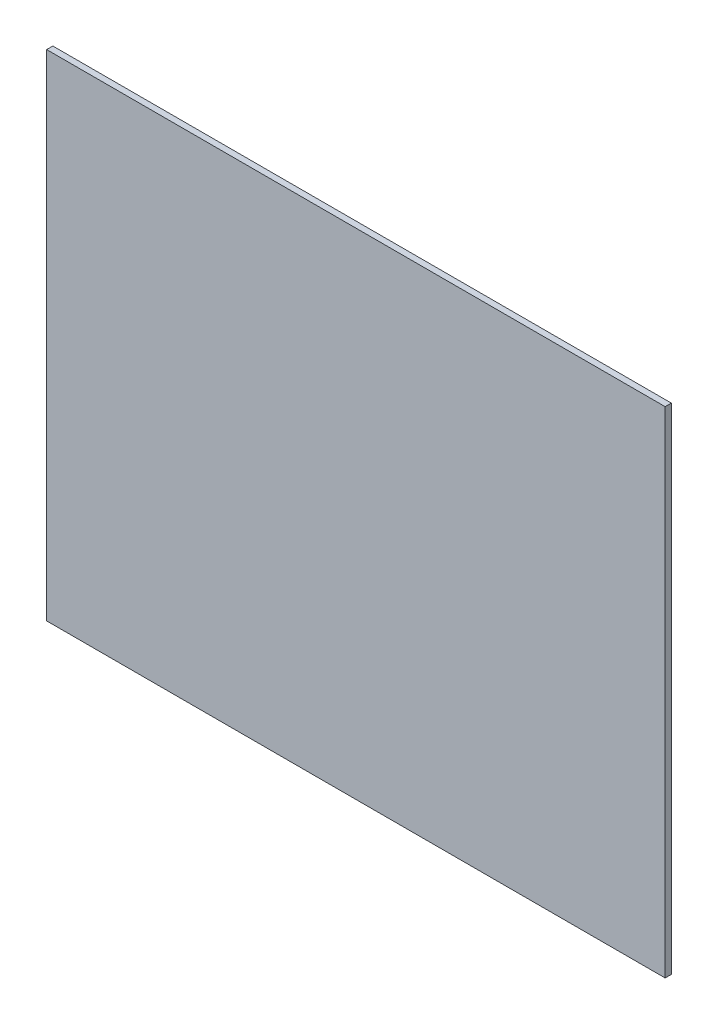
ISO-10303-21;
HEADER;
FILE_DESCRIPTION(('STEP AP214'),'2;1');
FILE_NAME('part.step','',(''),(''),'','','');
FILE_SCHEMA(('AUTOMOTIVE_DESIGN { 1 0 10303 214 1 1 1 1 }'));
ENDSEC;
DATA;
#1=APPLICATION_CONTEXT('core data for automotive mechanical design processes');
#2=APPLICATION_PROTOCOL_DEFINITION('international standard','automotive_design',2000,#1);
#3=PRODUCT_CONTEXT('',#1,'mechanical');
#4=PRODUCT('Part','Part','',(#3));
#5=PRODUCT_RELATED_PRODUCT_CATEGORY('part','',(#4));
#6=PRODUCT_DEFINITION_FORMATION('','',#4);
#7=PRODUCT_DEFINITION_CONTEXT('part definition',#1,'design');
#8=PRODUCT_DEFINITION('design','',#6,#7);
#9=PRODUCT_DEFINITION_SHAPE('','',#8);
#10=(LENGTH_UNIT() NAMED_UNIT(*) SI_UNIT(.MILLI.,.METRE.));
#11=(NAMED_UNIT(*) PLANE_ANGLE_UNIT() SI_UNIT($,.RADIAN.));
#12=(NAMED_UNIT(*) SI_UNIT($,.STERADIAN.) SOLID_ANGLE_UNIT());
#13=UNCERTAINTY_MEASURE_WITH_UNIT(LENGTH_MEASURE(1.E-05),#10,'distance_accuracy_value','');
#14=(GEOMETRIC_REPRESENTATION_CONTEXT(3) GLOBAL_UNCERTAINTY_ASSIGNED_CONTEXT((#13)) GLOBAL_UNIT_ASSIGNED_CONTEXT((#10,
#11,#12)) REPRESENTATION_CONTEXT('',''));
#15=CARTESIAN_POINT('',(0.,0.,0.));
#16=DIRECTION('',(0.,0.,1.));
#17=DIRECTION('',(1.,0.,0.));
#18=AXIS2_PLACEMENT_3D('',#15,#16,#17);
#19=CARTESIAN_POINT('',(-439.635691145185,251.016260162602,10.));
#20=DIRECTION('',(1.,0.,0.));
#21=DIRECTION('',(0.,1.,0.));
#22=AXIS2_PLACEMENT_3D('',#19,#20,#21);
#23=PLANE('',#22);
#24=DIRECTION('',(0.,-1.,0.));
#25=VECTOR('',#24,1.);
#26=CARTESIAN_POINT('',(-439.635691145185,251.016260162602,0.));
#27=LINE('',#26,#25);
#28=CARTESIAN_POINT('',(-439.635691145185,251.016260162602,0.));
#29=VERTEX_POINT('',#28);
#30=CARTESIAN_POINT('',(-439.635691145184,-548.983739837399,0.));
#31=VERTEX_POINT('',#30);
#32=EDGE_CURVE('E96',#29,#31,#27,.T.);
#33=ORIENTED_EDGE('',*,*,#32,.T.);
#34=DIRECTION('',(0.,0.,-1.));
#35=VECTOR('',#34,1.);
#36=CARTESIAN_POINT('',(-439.635691145184,-548.983739837399,10.));
#37=LINE('',#36,#35);
#38=CARTESIAN_POINT('',(-439.635691145184,-548.983739837399,10.));
#39=VERTEX_POINT('',#38);
#40=EDGE_CURVE('E11',#39,#31,#37,.T.);
#41=ORIENTED_EDGE('',*,*,#40,.F.);
#42=DIRECTION('',(0.,-1.,0.));
#43=VECTOR('',#42,1.);
#44=CARTESIAN_POINT('',(-439.635691145185,251.016260162602,10.));
#45=LINE('',#44,#43);
#46=CARTESIAN_POINT('',(-439.635691145185,251.016260162602,10.));
#47=VERTEX_POINT('',#46);
#48=EDGE_CURVE('E84',#47,#39,#45,.T.);
#49=ORIENTED_EDGE('',*,*,#48,.F.);
#50=DIRECTION('',(0.,0.,-1.));
#51=VECTOR('',#50,1.);
#52=CARTESIAN_POINT('',(-439.635691145185,251.016260162602,10.));
#53=LINE('',#52,#51);
#54=EDGE_CURVE('E92',#47,#29,#53,.T.);
#55=ORIENTED_EDGE('',*,*,#54,.T.);
#56=EDGE_LOOP('',(#33,#41,#49,#55));
#57=FACE_BOUND('',#56,.T.);
#58=ADVANCED_FACE('F33',(#57),#23,.F.);
#59=CARTESIAN_POINT('',(-439.635691145184,-548.983739837399,10.));
#60=DIRECTION('',(0.,1.,0.));
#61=DIRECTION('',(0.,0.,1.));
#62=AXIS2_PLACEMENT_3D('',#59,#60,#61);
#63=PLANE('',#62);
#64=DIRECTION('',(1.,0.,0.));
#65=VECTOR('',#64,1.);
#66=CARTESIAN_POINT('',(-439.635691145184,-548.983739837399,0.));
#67=LINE('',#66,#65);
#68=CARTESIAN_POINT('',(560.364308854815,-548.983739837399,0.));
#69=VERTEX_POINT('',#68);
#70=EDGE_CURVE('E88',#31,#69,#67,.T.);
#71=ORIENTED_EDGE('',*,*,#70,.T.);
#72=DIRECTION('',(0.,0.,-1.));
#73=VECTOR('',#72,1.);
#74=CARTESIAN_POINT('',(560.364308854815,-548.983739837399,10.));
#75=LINE('',#74,#73);
#76=CARTESIAN_POINT('',(560.364308854815,-548.983739837399,10.));
#77=VERTEX_POINT('',#76);
#78=EDGE_CURVE('E41',#77,#69,#75,.T.);
#79=ORIENTED_EDGE('',*,*,#78,.F.);
#80=DIRECTION('',(1.,0.,0.));
#81=VECTOR('',#80,1.);
#82=CARTESIAN_POINT('',(-439.635691145184,-548.983739837399,10.));
#83=LINE('',#82,#81);
#84=EDGE_CURVE('E79',#39,#77,#83,.T.);
#85=ORIENTED_EDGE('',*,*,#84,.F.);
#86=ORIENTED_EDGE('',*,*,#40,.T.);
#87=EDGE_LOOP('',(#71,#79,#85,#86));
#88=FACE_BOUND('',#87,.T.);
#89=ADVANCED_FACE('F87',(#88),#63,.F.);
#90=CARTESIAN_POINT('',(560.364308854815,251.016260162602,10.));
#91=DIRECTION('',(-1.,0.,0.));
#92=DIRECTION('',(0.,0.,1.));
#93=AXIS2_PLACEMENT_3D('',#90,#91,#92);
#94=PLANE('',#93);
#95=DIRECTION('',(0.,1.,0.));
#96=VECTOR('',#95,1.);
#97=CARTESIAN_POINT('',(560.364308854815,251.016260162602,0.));
#98=LINE('',#97,#96);
#99=CARTESIAN_POINT('',(560.364308854815,251.016260162602,0.));
#100=VERTEX_POINT('',#99);
#101=EDGE_CURVE('E66',#69,#100,#98,.T.);
#102=ORIENTED_EDGE('',*,*,#101,.T.);
#103=DIRECTION('',(0.,0.,-1.));
#104=VECTOR('',#103,1.);
#105=CARTESIAN_POINT('',(560.364308854815,251.016260162602,10.));
#106=LINE('',#105,#104);
#107=CARTESIAN_POINT('',(560.364308854815,251.016260162602,10.));
#108=VERTEX_POINT('',#107);
#109=EDGE_CURVE('E89',#108,#100,#106,.T.);
#110=ORIENTED_EDGE('',*,*,#109,.F.);
#111=DIRECTION('',(0.,1.,0.));
#112=VECTOR('',#111,1.);
#113=CARTESIAN_POINT('',(560.364308854815,251.016260162602,10.));
#114=LINE('',#113,#112);
#115=EDGE_CURVE('E82',#77,#108,#114,.T.);
#116=ORIENTED_EDGE('',*,*,#115,.F.);
#117=ORIENTED_EDGE('',*,*,#78,.T.);
#118=EDGE_LOOP('',(#102,#110,#116,#117));
#119=FACE_BOUND('',#118,.T.);
#120=ADVANCED_FACE('F90',(#119),#94,.F.);
#121=CARTESIAN_POINT('',(-439.635691145185,251.016260162602,10.));
#122=DIRECTION('',(0.,-1.,0.));
#123=DIRECTION('',(0.,0.,-1.));
#124=AXIS2_PLACEMENT_3D('',#121,#122,#123);
#125=PLANE('',#124);
#126=DIRECTION('',(-1.,0.,0.));
#127=VECTOR('',#126,1.);
#128=CARTESIAN_POINT('',(-439.635691145185,251.016260162602,0.));
#129=LINE('',#128,#127);
#130=EDGE_CURVE('E72',#100,#29,#129,.T.);
#131=ORIENTED_EDGE('',*,*,#130,.T.);
#132=ORIENTED_EDGE('',*,*,#54,.F.);
#133=DIRECTION('',(-1.,0.,0.));
#134=VECTOR('',#133,1.);
#135=CARTESIAN_POINT('',(-439.635691145185,251.016260162602,10.));
#136=LINE('',#135,#134);
#137=EDGE_CURVE('E49',#108,#47,#136,.T.);
#138=ORIENTED_EDGE('',*,*,#137,.F.);
#139=ORIENTED_EDGE('',*,*,#109,.T.);
#140=EDGE_LOOP('',(#131,#132,#138,#139));
#141=FACE_BOUND('',#140,.T.);
#142=ADVANCED_FACE('F103',(#141),#125,.F.);
#143=CARTESIAN_POINT('',(0.,0.,10.));
#144=DIRECTION('',(0.,0.,1.));
#145=DIRECTION('',(1.,0.,0.));
#146=AXIS2_PLACEMENT_3D('',#143,#144,#145);
#147=PLANE('',#146);
#148=ORIENTED_EDGE('',*,*,#48,.T.);
#149=ORIENTED_EDGE('',*,*,#84,.T.);
#150=ORIENTED_EDGE('',*,*,#115,.T.);
#151=ORIENTED_EDGE('',*,*,#137,.T.);
#152=EDGE_LOOP('',(#148,#149,#150,#151));
#153=FACE_BOUND('',#152,.T.);
#154=ADVANCED_FACE('F80',(#153),#147,.T.);
#155=CARTESIAN_POINT('',(0.,0.,0.));
#156=DIRECTION('',(0.,0.,1.));
#157=DIRECTION('',(1.,0.,0.));
#158=AXIS2_PLACEMENT_3D('',#155,#156,#157);
#159=PLANE('',#158);
#160=ORIENTED_EDGE('',*,*,#32,.F.);
#161=ORIENTED_EDGE('',*,*,#130,.F.);
#162=ORIENTED_EDGE('',*,*,#101,.F.);
#163=ORIENTED_EDGE('',*,*,#70,.F.);
#164=EDGE_LOOP('',(#160,#161,#162,#163));
#165=FACE_BOUND('',#164,.T.);
#166=ADVANCED_FACE('F106',(#165),#159,.F.);
#167=CLOSED_SHELL('',(#58,#89,#120,#142,#154,#166));
#168=MANIFOLD_SOLID_BREP('B2',#167);
#169=ADVANCED_BREP_SHAPE_REPRESENTATION('',(#18,#168),#14);
#170=SHAPE_DEFINITION_REPRESENTATION(#9,#169);
ENDSEC;
END-ISO-10303-21;
